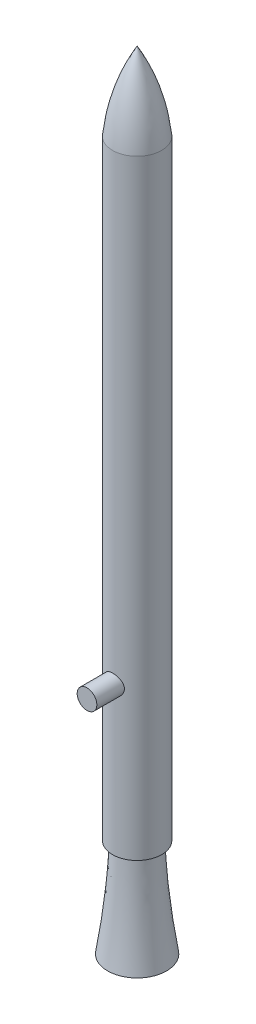
ISO-10303-21;
HEADER;
FILE_DESCRIPTION(('STEP AP214'),'2;1');
FILE_NAME('part.step','',(''),(''),'','','');
FILE_SCHEMA(('AUTOMOTIVE_DESIGN { 1 0 10303 214 1 1 1 1 }'));
ENDSEC;
DATA;
#1=APPLICATION_CONTEXT('core data for automotive mechanical design processes');
#2=APPLICATION_PROTOCOL_DEFINITION('international standard','automotive_design',2000,#1);
#3=PRODUCT_CONTEXT('',#1,'mechanical');
#4=PRODUCT('Part','Part','',(#3));
#5=PRODUCT_RELATED_PRODUCT_CATEGORY('part','',(#4));
#6=PRODUCT_DEFINITION_FORMATION('','',#4);
#7=PRODUCT_DEFINITION_CONTEXT('part definition',#1,'design');
#8=PRODUCT_DEFINITION('design','',#6,#7);
#9=PRODUCT_DEFINITION_SHAPE('','',#8);
#10=(LENGTH_UNIT() NAMED_UNIT(*) SI_UNIT(.MILLI.,.METRE.));
#11=(NAMED_UNIT(*) PLANE_ANGLE_UNIT() SI_UNIT($,.RADIAN.));
#12=(NAMED_UNIT(*) SI_UNIT($,.STERADIAN.) SOLID_ANGLE_UNIT());
#13=UNCERTAINTY_MEASURE_WITH_UNIT(LENGTH_MEASURE(1.E-05),#10,'distance_accuracy_value','');
#14=(GEOMETRIC_REPRESENTATION_CONTEXT(3) GLOBAL_UNCERTAINTY_ASSIGNED_CONTEXT((#13)) GLOBAL_UNIT_ASSIGNED_CONTEXT((#10,
#11,#12)) REPRESENTATION_CONTEXT('',''));
#15=CARTESIAN_POINT('',(0.,0.,0.));
#16=DIRECTION('',(0.,0.,1.));
#17=DIRECTION('',(1.,0.,0.));
#18=AXIS2_PLACEMENT_3D('',#15,#16,#17);
#19=CARTESIAN_POINT('',(0.,402.495416156833,0.));
#20=DIRECTION('',(0.,1.,0.));
#21=DIRECTION('',(0.,0.,1.));
#22=AXIS2_PLACEMENT_3D('',#19,#20,#21);
#23=CYLINDRICAL_SURFACE('',#22,250.000000000001);
#24=CARTESIAN_POINT('',(50.,2500.,-244.948974278318));
#25=CARTESIAN_POINT('',(49.999992344957,2501.38927586998,-244.948978091506));
#26=CARTESIAN_POINT('',(49.9420477303856,2502.77872480484,-244.960825763421));
#27=CARTESIAN_POINT('',(49.7107011907841,2505.54771697171,-245.007876943727));
#28=CARTESIAN_POINT('',(49.5372797458124,2506.92725848913,-245.043084400798));
#29=CARTESIAN_POINT('',(49.0761945639373,2509.66739984891,-245.135844853141));
#30=CARTESIAN_POINT('',(48.7884479608055,2511.02798520924,-245.193414056184));
#31=CARTESIAN_POINT('',(48.1009992505273,2513.7194392846,-245.329200120906));
#32=CARTESIAN_POINT('',(47.7013016421263,2515.05030919143,-245.407416152886));
#33=CARTESIAN_POINT('',(46.7934804348209,2517.67179590757,-245.582131761167));
#34=CARTESIAN_POINT('',(46.2854652861421,2518.96245150987,-245.678613039094));
#35=CARTESIAN_POINT('',(45.1645609164068,2521.49607920436,-245.887143200697));
#36=CARTESIAN_POINT('',(44.5516707419873,2522.73905086296,-245.999192225889));
#37=CARTESIAN_POINT('',(43.2255044861128,2525.16885567645,-246.235678044495));
#38=CARTESIAN_POINT('',(42.5122364537684,2526.35569332244,-246.360113844403));
#39=CARTESIAN_POINT('',(40.9902750338976,2528.66548964605,-246.617908561532));
#40=CARTESIAN_POINT('',(40.1815808640425,2529.78844779986,-246.751267551903));
#41=CARTESIAN_POINT('',(38.4634377890586,2531.97692557454,-247.024958237432));
#42=CARTESIAN_POINT('',(37.5528404143988,2533.04153533412,-247.165356946009));
#43=CARTESIAN_POINT('',(35.6456654320883,2535.09053304665,-247.447601580005));
#44=CARTESIAN_POINT('',(34.6490870984414,2536.07492032209,-247.589447517635));
#45=CARTESIAN_POINT('',(32.5766095135831,2537.95686822198,-247.870647459747));
#46=CARTESIAN_POINT('',(31.5007048438687,2538.8544229055,-248.010001293193));
#47=CARTESIAN_POINT('',(29.2768648788855,2540.55645178176,-248.282338984797));
#48=CARTESIAN_POINT('',(28.1289294035987,2541.36092574185,-248.415322827035));
#49=CARTESIAN_POINT('',(25.7584407357454,2542.87773217923,-248.672346947359));
#50=CARTESIAN_POINT('',(24.5353230499789,2543.58919784455,-248.796298895754));
#51=CARTESIAN_POINT('',(22.0321394761145,2544.90640336749,-249.030449515666));
#52=CARTESIAN_POINT('',(20.7520731534378,2545.51214241813,-249.140648082205));
#53=CARTESIAN_POINT('',(18.1441129561107,2546.6132433676,-249.344142767029));
#54=CARTESIAN_POINT('',(16.8162225507033,2547.10861325413,-249.43744010841));
#55=CARTESIAN_POINT('',(14.1220689879607,2547.98514109741,-249.604464060652));
#56=CARTESIAN_POINT('',(12.7558063915029,2548.36630072259,-249.678190957405));
#57=CARTESIAN_POINT('',(10.0130867761428,2549.00709324099,-249.803117838234));
#58=CARTESIAN_POINT('',(8.63700122335548,2549.26826108187,-249.85460181588));
#59=CARTESIAN_POINT('',(5.86712292042623,2549.67429994635,-249.93498429294));
#60=CARTESIAN_POINT('',(4.47333031050035,2549.81917189029,-249.963882971086));
#61=CARTESIAN_POINT('',(1.67833375249501,2549.99143390524,-249.998272626066));
#62=CARTESIAN_POINT('',(0.277130440352489,2550.01883389824,-250.003765579808));
#63=CARTESIAN_POINT('',(-2.5225208171731,2549.9559540338,-249.991192616829));
#64=CARTESIAN_POINT('',(-3.92096878394048,2549.8656750933,-249.973126883675));
#65=CARTESIAN_POINT('',(-6.68499625237991,2549.5703038186,-249.914374354252));
#66=CARTESIAN_POINT('',(-8.05076005989701,2549.36686754003,-249.874013898359));
#67=CARTESIAN_POINT('',(-10.7600101701659,2548.84797310716,-249.77201572997));
#68=CARTESIAN_POINT('',(-12.1034967198647,2548.5325161955,-249.710378253499));
#69=CARTESIAN_POINT('',(-14.7588737612817,2547.79200327982,-249.567513359007));
#70=CARTESIAN_POINT('',(-16.0707634266814,2547.36694441289,-249.486285429269));
#71=CARTESIAN_POINT('',(-18.6539305996116,2546.41042825654,-249.306452714331));
#72=CARTESIAN_POINT('',(-19.9252077134791,2545.87896993614,-249.207847760755));
#73=CARTESIAN_POINT('',(-22.4264306982884,2544.70987484557,-248.995262213484));
#74=CARTESIAN_POINT('',(-23.6560662808075,2544.07159120843,-248.881188803798));
#75=CARTESIAN_POINT('',(-26.0572978649221,2542.69580719278,-248.641254333519));
#76=CARTESIAN_POINT('',(-27.2288937241742,2541.95830657096,-248.515393244017));
#77=CARTESIAN_POINT('',(-29.5064151983384,2540.38915678702,-248.255282947057));
#78=CARTESIAN_POINT('',(-30.6123344536147,2539.55749852996,-248.121032929853));
#79=CARTESIAN_POINT('',(-32.75113487723,2537.80574050746,-247.847787415111));
#80=CARTESIAN_POINT('',(-33.7840151570575,2536.88563966644,-247.708791859875));
#81=CARTESIAN_POINT('',(-35.787295501769,2534.9463400678,-247.427384405649));
#82=CARTESIAN_POINT('',(-36.7562911086083,2533.92569245322,-247.284955211059));
#83=CARTESIAN_POINT('',(-38.6050247991491,2531.8061268176,-247.003090431034));
#84=CARTESIAN_POINT('',(-39.4847617951622,2530.70720784304,-246.863654882096));
#85=CARTESIAN_POINT('',(-41.1488678348685,2528.4385255,-246.591730915548));
#86=CARTESIAN_POINT('',(-41.9332345152392,2527.268760377,-246.459242670142));
#87=CARTESIAN_POINT('',(-43.4009733293186,2524.86638104931,-246.205017218443));
#88=CARTESIAN_POINT('',(-44.0843458593415,2523.63376709128,-246.083279969963));
#89=CARTESIAN_POINT('',(-45.3464414894094,2521.11144810839,-245.853844342931));
#90=CARTESIAN_POINT('',(-45.9249351657537,2519.82162542507,-245.746176882384));
#91=CARTESIAN_POINT('',(-46.9710398675145,2517.19644884438,-245.548376133083));
#92=CARTESIAN_POINT('',(-47.4386505139941,2515.86109479143,-245.45824290425));
#93=CARTESIAN_POINT('',(-48.2592621239872,2513.1545822946,-245.298223702858));
#94=CARTESIAN_POINT('',(-48.6122753214291,2511.78342768953,-245.228335569105));
#95=CARTESIAN_POINT('',(-49.2008974418805,2509.01520769786,-245.110917636318));
#96=CARTESIAN_POINT('',(-49.4365082552914,2507.61814272885,-245.063387477279));
#97=CARTESIAN_POINT('',(-49.7853709795761,2504.83253061114,-244.992750828118));
#98=CARTESIAN_POINT('',(-49.9006486311287,2503.44424711357,-244.969240133119));
#99=CARTESIAN_POINT('',(-50.014980286726,2500.6627101483,-244.945923030888));
#100=CARTESIAN_POINT('',(-50.0140356097805,2499.26945673718,-244.946116354639));
#101=CARTESIAN_POINT('',(-49.8959351937506,2496.48816963004,-244.970200718025));
#102=CARTESIAN_POINT('',(-49.7787856351993,2495.10013566037,-244.994090497328));
#103=CARTESIAN_POINT('',(-49.4292338278076,2492.33925630389,-245.064853788263));
#104=CARTESIAN_POINT('',(-49.1968318251813,2490.96641088464,-245.111727250794));
#105=CARTESIAN_POINT('',(-48.6214175860752,2488.2588385855,-245.22651324641));
#106=CARTESIAN_POINT('',(-48.279490227383,2486.92387212567,-245.294219179249));
#107=CARTESIAN_POINT('',(-47.4870410927173,2484.28773648272,-245.448861749017));
#108=CARTESIAN_POINT('',(-47.0365202230002,2482.98656701766,-245.535798225459));
#109=CARTESIAN_POINT('',(-46.0302138759689,2480.42678235451,-245.726436231992));
#110=CARTESIAN_POINT('',(-45.4744217864711,2479.16816983533,-245.830138815117));
#111=CARTESIAN_POINT('',(-44.2616102954817,2476.70197013557,-246.051396258329));
#112=CARTESIAN_POINT('',(-43.6045895376501,2475.49438363895,-246.168951304016));
#113=CARTESIAN_POINT('',(-42.1847296195536,2473.1228075798,-246.416262440492));
#114=CARTESIAN_POINT('',(-41.42062300066,2471.95959127499,-246.546157572327));
#115=CARTESIAN_POINT('',(-39.7985926672211,2469.70140799398,-246.813183077381));
#116=CARTESIAN_POINT('',(-38.9406682630056,2468.60644151959,-246.950313503785));
#117=CARTESIAN_POINT('',(-37.136768605078,2466.49191289575,-247.228018274879));
#118=CARTESIAN_POINT('',(-36.1907854135783,2465.47235755891,-247.368592929195));
#119=CARTESIAN_POINT('',(-34.2171663492078,2463.5155284846,-247.649306068989));
#120=CARTESIAN_POINT('',(-33.189529785351,2462.57825544358,-247.789444550766));
#121=CARTESIAN_POINT('',(-31.0430294198751,2460.7785531273,-248.067569719376));
#122=CARTESIAN_POINT('',(-29.9230059549897,2459.9174960821,-248.205490198393));
#123=CARTESIAN_POINT('',(-27.6134451842197,2458.29279313283,-248.473034393029));
#124=CARTESIAN_POINT('',(-26.42390707257,2457.52914835821,-248.602658012441));
#125=CARTESIAN_POINT('',(-23.9835436745959,2456.10483454493,-248.849941648259));
#126=CARTESIAN_POINT('',(-22.7327200703861,2455.44416268202,-248.967601992752));
#127=CARTESIAN_POINT('',(-20.1784915470321,2454.23071391631,-249.18762272896));
#128=CARTESIAN_POINT('',(-18.8750871610519,2453.6779359198,-249.289983275766));
#129=CARTESIAN_POINT('',(-16.2325615275738,2452.6873853024,-249.475946859591));
#130=CARTESIAN_POINT('',(-14.8936885669717,2452.24897006011,-249.559654305975));
#131=CARTESIAN_POINT('',(-12.1826711210453,2451.48644275413,-249.706678172043));
#132=CARTESIAN_POINT('',(-10.81052670553,2451.16233045063,-249.769994634507));
#133=CARTESIAN_POINT('',(-8.04308580416522,2450.63104403272,-249.874420220784));
#134=CARTESIAN_POINT('',(-6.64779166627997,2450.42385813275,-249.915531582732));
#135=CARTESIAN_POINT('',(-3.84420600321766,2450.12807509416,-249.974374281458));
#136=CARTESIAN_POINT('',(-2.43591465177961,2450.03947637262,-249.992105930307));
#137=CARTESIAN_POINT('',(0.358638400995768,2449.98209833555,-250.003579571549));
#138=CARTESIAN_POINT('',(1.74485654078014,2450.01125881142,-249.997734051015));
#139=CARTESIAN_POINT('',(4.50978769605547,2450.18453573875,-249.963143843918));
#140=CARTESIAN_POINT('',(5.88850080450128,2450.32865076314,-249.934399441625));
#141=CARTESIAN_POINT('',(8.62855178170661,2450.73068426934,-249.854811310789));
#142=CARTESIAN_POINT('',(9.9898899549193,2450.98860075422,-249.803967970024));
#143=CARTESIAN_POINT('',(12.6855963685322,2451.61621291712,-249.681589699063));
#144=CARTESIAN_POINT('',(14.0199645054308,2451.98590902402,-249.610054689476));
#145=CARTESIAN_POINT('',(16.6494066113678,2452.8332647284,-249.448448577958));
#146=CARTESIAN_POINT('',(17.9445636821703,2453.31067476844,-249.358420364587));
#147=CARTESIAN_POINT('',(20.4899443313465,2454.37037488139,-249.162179604726));
#148=CARTESIAN_POINT('',(21.7401680637626,2454.95266459471,-249.055967113725));
#149=CARTESIAN_POINT('',(24.1873935202015,2456.21795351528,-248.830223784338));
#150=CARTESIAN_POINT('',(25.384392115349,2456.90095863299,-248.710692164423));
#151=CARTESIAN_POINT('',(27.7172146222479,2458.36286631829,-248.461530874939));
#152=CARTESIAN_POINT('',(28.8530377356276,2459.14177013697,-248.331901073638));
#153=CARTESIAN_POINT('',(31.0738905467881,2460.80347511168,-248.063872068247));
#154=CARTESIAN_POINT('',(32.1578047442401,2461.68775009833,-247.925365104304));
#155=CARTESIAN_POINT('',(34.2475632107648,2463.54375983559,-247.645343379139));
#156=CARTESIAN_POINT('',(35.2534064728154,2464.515495714,-247.503828579148));
#157=CARTESIAN_POINT('',(37.1804808945906,2466.54009217778,-247.221683155537));
#158=CARTESIAN_POINT('',(38.1016920602941,2467.59297182558,-247.081052748123));
#159=CARTESIAN_POINT('',(39.8529509314188,2469.77258368871,-246.804636086908));
#160=CARTESIAN_POINT('',(40.6829992690011,2470.89931539183,-246.668849799519));
#161=CARTESIAN_POINT('',(42.2546031928156,2473.23160260142,-246.40452625796));
#162=CARTESIAN_POINT('',(42.9951084142612,2474.43787686939,-246.276082923509));
#163=CARTESIAN_POINT('',(44.3717202832077,2476.90991615761,-246.031785430628));
#164=CARTESIAN_POINT('',(45.0078213229278,2478.17568436871,-245.91593194854));
#165=CARTESIAN_POINT('',(46.1703012663192,2480.75668893815,-245.700330964962));
#166=CARTESIAN_POINT('',(46.6967700451887,2482.07188372462,-245.600570286029));
#167=CARTESIAN_POINT('',(47.6364843176399,2484.74322330291,-245.420037348009));
#168=CARTESIAN_POINT('',(48.0497517169173,2486.09936011553,-245.339261415598));
#169=CARTESIAN_POINT('',(48.6690140139464,2488.49175957459,-245.217044597207));
#170=CARTESIAN_POINT('',(48.9009879697861,2489.52114012774,-245.170827104832));
#171=CARTESIAN_POINT('',(49.2994837868582,2491.59322123542,-245.091008394178));
#172=CARTESIAN_POINT('',(49.4659941876441,2492.63592408928,-245.057409385013));
#173=CARTESIAN_POINT('',(49.7327072514396,2494.7300887016,-245.003421158296));
#174=CARTESIAN_POINT('',(49.8329116935999,2495.78155022428,-244.983031586303));
#175=CARTESIAN_POINT('',(49.9665548875057,2497.88864171517,-244.955807933714));
#176=CARTESIAN_POINT('',(50.0000058171685,2498.94427088786,-244.948971380627));
#177=CARTESIAN_POINT('',(50.,2500.,-244.948974278318));
#178=B_SPLINE_CURVE_WITH_KNOTS('',3,(#24,#25,#26,#27,#28,#29,#30,#31,#32,#33,#34,#35,#36,#37,
#38,#39,#40,#41,#42,#43,#44,#45,#46,#47,#48,#49,#50,#51,#52,#53,#54,#55,#56,#57,#58,#59,#60,#61,
#62,#63,#64,#65,#66,#67,#68,#69,#70,#71,#72,#73,#74,#75,#76,#77,#78,#79,#80,#81,#82,#83,#84,#85,
#86,#87,#88,#89,#90,#91,#92,#93,#94,#95,#96,#97,#98,#99,#100,#101,#102,#103,#104,#105,#106,#107,
#108,#109,#110,#111,#112,#113,#114,#115,#116,#117,#118,#119,#120,#121,#122,#123,#124,#125,#126,
#127,#128,#129,#130,#131,#132,#133,#134,#135,#136,#137,#138,#139,#140,#141,#142,#143,#144,#145,
#146,#147,#148,#149,#150,#151,#152,#153,#154,#155,#156,#157,#158,#159,#160,#161,#162,#163,#164,
#165,#166,#167,#168,#169,#170,#171,#172,#173,#174,#175,#176,#177),.UNSPECIFIED.,.T.,.F.,(4,2,2,
2,2,2,2,2,2,2,2,2,2,2,2,2,2,2,2,2,2,2,2,2,2,2,2,2,2,2,2,2,2,2,2,2,2,2,2,2,2,2,2,2,2,2,2,2,2,2,2,
2,2,2,2,2,2,2,2,2,2,2,2,2,2,2,2,2,2,2,2,2,2,2,2,2,4),(0.,4.16687263007994,8.33444979772641,
12.5050532746422,16.6754891801099,20.8417689857357,25.0080866668075,29.1740704489092,
33.3400883872187,37.5589793708714,41.7779059810006,45.9971210386217,50.2163466412443,
54.4724500071243,58.7285858571717,62.9844135790819,67.2401791268965,71.4398751585651,
75.63953795499,79.8388460299282,84.0381213845097,88.1774986663138,92.3168300317315,
96.4562695312197,100.595749142694,104.761267378561,108.926795829929,113.092726984714,
117.258708808893,121.497372794427,125.736088425303,129.9749090722,134.213713084972,
138.461680501079,142.709662434182,146.957190721846,151.204650614027,155.379393529153,
159.554089065034,163.728562575296,167.903027167656,172.037358808722,176.171655948321,
180.306212853149,184.440825160784,188.629320529907,192.817846691428,197.006750781014,
201.195690322694,205.449032571299,209.702424131451,213.955699013292,218.208930778173,
222.437721465038,226.666503279967,230.894858780678,235.123157840886,239.277805713339,
243.432402010078,247.586925407471,251.741464745463,255.886475703052,260.031472449174,
264.176712540417,268.322006716077,272.534197082486,276.74644177211,280.959679043722,
285.172887097146,289.431511725064,293.690365018377,297.945713090068,302.200237123049,
305.36680744973,308.533931888812,311.700971342773,314.867432977376),.UNSPECIFIED.);
#179=CARTESIAN_POINT('',(50.,2500.,-244.948974278318));
#180=VERTEX_POINT('',#179);
#181=EDGE_CURVE('E37',#180,#180,#178,.T.);
#182=ORIENTED_EDGE('',*,*,#181,.T.);
#183=EDGE_LOOP('',(#182));
#184=FACE_BOUND('',#183,.T.);
#185=CARTESIAN_POINT('',(0.,1000.,0.));
#186=DIRECTION('',(0.,1.,0.));
#187=DIRECTION('',(0.,0.,1.));
#188=AXIS2_PLACEMENT_3D('',#185,#186,#187);
#189=CIRCLE('',#188,250.000000000001);
#190=CARTESIAN_POINT('',(0.,1000.,250.000000000001));
#191=VERTEX_POINT('',#190);
#192=EDGE_CURVE('E56',#191,#191,#189,.T.);
#193=ORIENTED_EDGE('',*,*,#192,.T.);
#194=EDGE_LOOP('',(#193));
#195=FACE_BOUND('',#194,.T.);
#196=CARTESIAN_POINT('',(0.,7205.04507490799,0.));
#197=DIRECTION('',(0.,1.,0.));
#198=DIRECTION('',(0.,0.,1.));
#199=AXIS2_PLACEMENT_3D('',#196,#197,#198);
#200=CIRCLE('',#199,250.);
#201=CARTESIAN_POINT('',(0.,7205.04507490799,250.));
#202=VERTEX_POINT('',#201);
#203=EDGE_CURVE('E54',#202,#202,#200,.T.);
#204=ORIENTED_EDGE('',*,*,#203,.F.);
#205=EDGE_LOOP('',(#204));
#206=FACE_BOUND('',#205,.T.);
#207=CARTESIAN_POINT('',(0.,2400.,250.000000000001));
#208=CARTESIAN_POINT('',(1.34443918910818,2400.00000120163,249.999999044269));
#209=CARTESIAN_POINT('',(2.68895959985831,2400.02712100468,249.989147764124));
#210=CARTESIAN_POINT('',(5.37561012109808,2400.13553835224,249.945810720796));
#211=CARTESIAN_POINT('',(6.71773986807743,2400.21684353032,249.913321909339));
#212=CARTESIAN_POINT('',(9.39774710615844,2400.43348609089,249.826901687005));
#213=CARTESIAN_POINT('',(10.7356216171232,2400.56885536206,249.77295762123));
#214=CARTESIAN_POINT('',(13.4038313765272,2400.89327215723,249.643989236973));
#215=CARTESIAN_POINT('',(14.7341665532189,2401.08232019119,249.568964718223));
#216=CARTESIAN_POINT('',(17.3880683751208,2401.51412859001,249.398130422914));
#217=CARTESIAN_POINT('',(18.7116107929106,2401.75701805773,249.302270697925));
#218=CARTESIAN_POINT('',(21.3462928157659,2402.29563095615,249.090510508303));
#219=CARTESIAN_POINT('',(22.6574322899309,2402.59135494383,248.974609832406));
#220=CARTESIAN_POINT('',(25.2647028572698,2403.23483383793,248.72356071176));
#221=CARTESIAN_POINT('',(26.5608371974566,2403.58257725206,248.588416518669));
#222=CARTESIAN_POINT('',(29.1362939338311,2404.32934507584,248.299729429455));
#223=CARTESIAN_POINT('',(30.4156148164152,2404.72837406801,248.14618488929));
#224=CARTESIAN_POINT('',(32.9509467920324,2405.57534528805,247.822240404429));
#225=CARTESIAN_POINT('',(34.2070217289595,2406.02311878171,247.651898786049));
#226=CARTESIAN_POINT('',(36.6983719440695,2406.96772329253,247.294992453916));
#227=CARTESIAN_POINT('',(37.9336452407421,2407.46455895263,247.108426204966));
#228=CARTESIAN_POINT('',(40.3813237246668,2408.50618892702,246.720254246071));
#229=CARTESIAN_POINT('',(41.5937302690441,2409.05098038424,246.518649432194));
#230=CARTESIAN_POINT('',(43.9939816354032,2410.18745409074,246.10163392112));
#231=CARTESIAN_POINT('',(45.1818243416299,2410.77914035817,245.886222041177));
#232=CARTESIAN_POINT('',(48.7046376208913,2412.62220955533,245.221458033402));
#233=CARTESIAN_POINT('',(51.0005697641036,2413.94231729456,244.753308929984));
#234=CARTESIAN_POINT('',(55.4747062067772,2416.75613041791,243.778179929235));
#235=CARTESIAN_POINT('',(57.6529079216342,2418.24983961095,243.271199180002));
#236=CARTESIAN_POINT('',(60.8685715350783,2420.64694000845,242.4794985617));
#237=CARTESIAN_POINT('',(61.9532388272621,2421.49087302851,242.204481978087));
#238=CARTESIAN_POINT('',(64.0860316642256,2423.22196622078,241.648907277409));
#239=CARTESIAN_POINT('',(65.1341592126141,2424.10912401638,241.368349465515));
#240=CARTESIAN_POINT('',(67.1923700348856,2425.92524773061,240.803497138285));
#241=CARTESIAN_POINT('',(68.2024558145853,2426.85421088663,240.519202870741));
#242=CARTESIAN_POINT('',(70.1834584062609,2428.75278808654,239.948630335061));
#243=CARTESIAN_POINT('',(71.1543658856784,2429.72241170518,239.662351613022));
#244=CARTESIAN_POINT('',(74.0065740332669,2432.69058490755,238.803202146018));
#245=CARTESIAN_POINT('',(75.8270441050216,2434.74815765923,238.230105798686));
#246=CARTESIAN_POINT('',(79.2943232879578,2439.00857963684,237.09858193073));
#247=CARTESIAN_POINT('',(80.9411326101945,2441.21142868621,236.540154392278));
#248=CARTESIAN_POINT('',(83.3078981888259,2444.6659219674,235.712822262053));
#249=CARTESIAN_POINT('',(84.0949370293961,2445.86949077006,235.432998050436));
#250=CARTESIAN_POINT('',(85.6172277638508,2448.31094052206,234.88368368782));
#251=CARTESIAN_POINT('',(86.352491739858,2449.54881337166,234.614191132569));
#252=CARTESIAN_POINT('',(87.77001513689,2452.05732198711,234.087582492239));
#253=CARTESIAN_POINT('',(88.4522674790742,2453.32796209843,233.830468061795));
#254=CARTESIAN_POINT('',(89.7622789180197,2455.8999306633,233.330719808614));
#255=CARTESIAN_POINT('',(90.3900347200992,2457.20126096623,233.088086861655));
#256=CARTESIAN_POINT('',(91.5893563748734,2459.83187084517,232.619440688339));
#257=CARTESIAN_POINT('',(92.1609441561408,2461.16113926583,232.393420984755));
#258=CARTESIAN_POINT('',(93.2468387982724,2463.84583425884,231.959843265579));
#259=CARTESIAN_POINT('',(93.7611458602674,2465.20126073933,231.752285185162));
#260=CARTESIAN_POINT('',(94.7311440284947,2467.93577004373,231.357482205953));
#261=CARTESIAN_POINT('',(95.1868381137643,2469.3148516613,231.17023627486));
#262=CARTESIAN_POINT('',(96.0384061531344,2472.0941425864,230.817757026988));
#263=CARTESIAN_POINT('',(96.4342805273904,2473.49435174544,230.652523555601));
#264=CARTESIAN_POINT('',(97.1485154027833,2476.24925094289,230.352575596615));
#265=CARTESIAN_POINT('',(97.46957584626,2477.60312781753,230.216817324412));
#266=CARTESIAN_POINT('',(98.055267891023,2480.32508256622,229.967966736869));
#267=CARTESIAN_POINT('',(98.3199005389395,2481.69316017638,229.854874001128));
#268=CARTESIAN_POINT('',(98.7919870565493,2484.44087211935,229.652366169459));
#269=CARTESIAN_POINT('',(98.999441653375,2485.82050630496,229.562950772427));
#270=CARTESIAN_POINT('',(99.3565673775043,2488.58860310206,229.408610090931));
#271=CARTESIAN_POINT('',(99.5062384269943,2489.97706572543,229.343684839447));
#272=CARTESIAN_POINT('',(99.7472943514507,2492.75939826193,229.238946400878));
#273=CARTESIAN_POINT('',(99.8387037519255,2494.15326565096,229.19912264728));
#274=CARTESIAN_POINT('',(99.9630560443568,2496.9441065174,229.14491492964));
#275=CARTESIAN_POINT('',(99.9959987625562,2498.34108000403,229.130531041202));
#276=CARTESIAN_POINT('',(100.003315400308,2501.13515059438,229.127337779749));
#277=CARTESIAN_POINT('',(99.9776917098469,2502.53224769074,229.138527363128));
#278=CARTESIAN_POINT('',(99.867959259735,2505.32369200771,229.18637463168));
#279=CARTESIAN_POINT('',(99.783851344024,2506.71803926772,229.223031949349));
#280=CARTESIAN_POINT('',(99.5653141017869,2509.40398637259,229.318035271013));
#281=CARTESIAN_POINT('',(99.4348052497325,2510.69596724277,229.374689559083));
#282=CARTESIAN_POINT('',(99.1237343999705,2513.27289447792,229.509289603612));
#283=CARTESIAN_POINT('',(98.9431679426902,2514.55784020573,229.587237257063));
#284=CARTESIAN_POINT('',(98.5324819317179,2517.11813975886,229.763791594503));
#285=CARTESIAN_POINT('',(98.3023703348832,2518.39349509039,229.862394961155));
#286=CARTESIAN_POINT('',(97.7931197711435,2520.93281620498,230.079513066456));
#287=CARTESIAN_POINT('',(97.5139752542855,2522.1967806817,230.198030059029));
#288=CARTESIAN_POINT('',(96.907328749286,2524.71117759361,230.454069197611));
#289=CARTESIAN_POINT('',(96.5798239816045,2525.96160924657,230.59159243599));
#290=CARTESIAN_POINT('',(95.8772207377736,2528.44690054633,230.884610566822));
#291=CARTESIAN_POINT('',(95.5021219383028,2529.68176008729,231.040105581362));
#292=CARTESIAN_POINT('',(94.7051311770896,2532.13410245873,231.367940263988));
#293=CARTESIAN_POINT('',(94.2832361737345,2533.35158415388,231.54028102691));
#294=CARTESIAN_POINT('',(93.3935922921902,2535.76721254411,231.900554524923));
#295=CARTESIAN_POINT('',(92.9258470994566,2536.96536078421,232.08848600664));
#296=CARTESIAN_POINT('',(91.9353874628039,2539.36500436524,232.482632414874));
#297=CARTESIAN_POINT('',(91.4117455870202,2540.56606845637,232.689142325887));
#298=CARTESIAN_POINT('',(90.3187030823888,2542.9446735258,233.115585029283));
#299=CARTESIAN_POINT('',(89.7493047304962,2544.12221567095,233.335517153614));
#300=CARTESIAN_POINT('',(88.5658073083039,2546.4521781643,233.787294126954));
#301=CARTESIAN_POINT('',(87.9517117971339,2547.60460050325,234.019138027026));
#302=CARTESIAN_POINT('',(86.6797647147828,2549.88307775146,234.493238982694));
#303=CARTESIAN_POINT('',(86.0219042896816,2551.00912726266,234.735498141835));
#304=CARTESIAN_POINT('',(83.9841890362035,2554.34563016984,235.475572214673));
#305=CARTESIAN_POINT('',(82.5402080222738,2556.51442261353,235.98668071867));
#306=CARTESIAN_POINT('',(79.4903497731825,2560.72933346996,237.031393291959));
#307=CARTESIAN_POINT('',(77.8844641832367,2562.77544554331,237.564998521326));
#308=CARTESIAN_POINT('',(75.2959928621372,2565.82152689137,238.393413590168));
#309=CARTESIAN_POINT('',(74.3674753159376,2566.868803666,238.684868868265));
#310=CARTESIAN_POINT('',(72.4675972410793,2568.92317499045,239.268540437859));
#311=CARTESIAN_POINT('',(71.4962463532681,2569.93027848619,239.560756544318));
#312=CARTESIAN_POINT('',(69.5118535571023,2571.90312998917,240.1440649446));
#313=CARTESIAN_POINT('',(68.4988061482387,2572.86887250565,240.435157084577));
#314=CARTESIAN_POINT('',(66.4325203687863,2574.75747041578,241.014255755814));
#315=CARTESIAN_POINT('',(65.3792796255622,2575.68032327048,241.30226210363));
#316=CARTESIAN_POINT('',(63.2340222972818,2577.48174307969,241.873294572717));
#317=CARTESIAN_POINT('',(62.1420004508609,2578.36030398577,242.156320010388));
#318=CARTESIAN_POINT('',(59.9207770111167,2580.07163205707,242.715496409452));
#319=CARTESIAN_POINT('',(58.7915721677966,2580.90439520223,242.991646766202));
#320=CARTESIAN_POINT('',(56.4978016890819,2582.52253120743,243.535187309482));
#321=CARTESIAN_POINT('',(55.333239120541,2583.30790816009,243.802578251626));
#322=CARTESIAN_POINT('',(52.9702703302655,2584.8299812065,244.326861385698));
#323=CARTESIAN_POINT('',(51.7718611557412,2585.5666730341,244.583752656817));
#324=CARTESIAN_POINT('',(49.3190199020019,2587.00399233031,245.090255606699));
#325=CARTESIAN_POINT('',(48.0639481779686,2587.70361526336,245.339621996808));
#326=CARTESIAN_POINT('',(45.5226234751797,2589.04918840948,245.823847335158));
#327=CARTESIAN_POINT('',(44.2363706688903,2589.69513891934,246.058706363616));
#328=CARTESIAN_POINT('',(41.6347183711246,2590.93197993909,246.512259150096));
#329=CARTESIAN_POINT('',(40.3193163619825,2591.52286566983,246.730951504647));
#330=CARTESIAN_POINT('',(37.6619028072753,2592.64805889999,247.150541828426));
#331=CARTESIAN_POINT('',(36.3198940443968,2593.18237227939,247.35144164661));
#332=CARTESIAN_POINT('',(33.6119658675053,2594.19301289556,247.733939847785));
#333=CARTESIAN_POINT('',(32.2460536838117,2594.66935733154,247.915543953717));
#334=CARTESIAN_POINT('',(29.4926409483675,2595.56295744474,248.258149005862));
#335=CARTESIAN_POINT('',(28.1051426805363,2595.98021932664,248.41915211536));
#336=CARTESIAN_POINT('',(25.3111246656454,2596.75457873227,248.719362166973));
#337=CARTESIAN_POINT('',(23.9046049403059,2597.1116763247,248.858569133973));
#338=CARTESIAN_POINT('',(21.0753861035882,2597.76469578258,249.114121287595));
#339=CARTESIAN_POINT('',(19.6526872192227,2598.06061850527,249.230466794572));
#340=CARTESIAN_POINT('',(16.8787363815535,2598.57473562706,249.433209724484));
#341=CARTESIAN_POINT('',(15.5282438968041,2598.79649579468,249.520972837954));
#342=CARTESIAN_POINT('',(12.8180873427788,2599.18452729909,249.674865992117));
#343=CARTESIAN_POINT('',(11.4584233530543,2599.35079911653,249.740996220204));
#344=CARTESIAN_POINT('',(8.73257009025241,2599.62740015106,249.851161228027));
#345=CARTESIAN_POINT('',(7.36638103483926,2599.73773122124,249.895196739678));
#346=CARTESIAN_POINT('',(4.63008032279352,2599.90215686452,249.960867457703));
#347=CARTESIAN_POINT('',(3.25996865645307,2599.9562512983,249.982502608592));
#348=CARTESIAN_POINT('',(0.518818364152871,2600.00804743714,250.003217956326));
#349=CARTESIAN_POINT('',(-0.852219982956067,2600.0057618615,250.002303240415));
#350=CARTESIAN_POINT('',(-3.59284139916143,2599.94483561025,249.977937798479));
#351=CARTESIAN_POINT('',(-4.96242447016723,2599.88619500868,249.954487102059));
#352=CARTESIAN_POINT('',(-7.69743440676699,2599.71272275696,249.885215175801));
#353=CARTESIAN_POINT('',(-9.062861339912,2599.59789202505,249.839394311528));
#354=CARTESIAN_POINT('',(-11.7869277480958,2599.3123548075,249.725702842974));
#355=CARTESIAN_POINT('',(-13.1455672808516,2599.14164879784,249.657832426517));
#356=CARTESIAN_POINT('',(-15.7924220850825,2598.75376946784,249.504061650169));
#357=CARTESIAN_POINT('',(-17.0810512931324,2598.53903751047,249.419111892336));
#358=CARTESIAN_POINT('',(-19.6476623347927,2598.05954232989,249.230064979789));
#359=CARTESIAN_POINT('',(-20.9256432842345,2597.79477499442,249.125966251297));
#360=CARTESIAN_POINT('',(-23.4685399307727,2597.21588239819,248.899290635038));
#361=CARTESIAN_POINT('',(-24.7334573077038,2596.90176356987,248.776716155477));
#362=CARTESIAN_POINT('',(-27.2484503270448,2596.22483034891,248.513823950274));
#363=CARTESIAN_POINT('',(-28.4985245956823,2595.86201148659,248.373504596081));
#364=CARTESIAN_POINT('',(-30.9817104342371,2595.08850996016,248.07599096292));
#365=CARTESIAN_POINT('',(-32.2148223168833,2594.67782817982,247.918796995535));
#366=CARTESIAN_POINT('',(-34.6623235332931,2593.80943229937,247.588465678739));
#367=CARTESIAN_POINT('',(-35.8767112026095,2593.35171404547,247.415326921382));
#368=CARTESIAN_POINT('',(-38.2847791325609,2592.39023961949,247.054159853368));
#369=CARTESIAN_POINT('',(-39.4784606708649,2591.88648630012,246.866132465425));
#370=CARTESIAN_POINT('',(-41.8435840083754,2590.83386026593,246.476268965082));
#371=CARTESIAN_POINT('',(-43.0150237606602,2590.2849834229,246.274431589536));
#372=CARTESIAN_POINT('',(-45.3692844183429,2589.12576209247,245.851787323561));
#373=CARTESIAN_POINT('',(-46.5513647840479,2588.51405439878,245.630589851593));
#374=CARTESIAN_POINT('',(-48.8884369133824,2587.24499729435,245.176138150484));
#375=CARTESIAN_POINT('',(-50.0434261858896,2586.58764370816,244.942882818851));
#376=CARTESIAN_POINT('',(-53.465132805598,2584.54896027938,244.227160179166));
#377=CARTESIAN_POINT('',(-55.6891533649009,2583.10072953517,243.72863387778));
#378=CARTESIAN_POINT('',(-60.0109185799443,2580.03569605616,242.700696400696));
#379=CARTESIAN_POINT('',(-62.1086205768566,2578.41883687216,242.171274908972));
#380=CARTESIAN_POINT('',(-66.1666788723709,2575.0264222633,241.094125829789));
#381=CARTESIAN_POINT('',(-68.1270297414955,2573.25086057125,240.546397519925));
#382=CARTESIAN_POINT('',(-72.0249589641748,2569.42867783734,239.409264001398));
#383=CARTESIAN_POINT('',(-73.9524729462067,2567.37189835831,238.819496427513));
#384=CARTESIAN_POINT('',(-77.6286435373243,2563.10095370447,237.649983314523));
#385=CARTESIAN_POINT('',(-79.3772919729688,2560.88678134526,237.070238234411));
#386=CARTESIAN_POINT('',(-81.8572656829208,2557.45764093548,236.220559282696));
#387=CARTESIAN_POINT('',(-82.6602573954637,2556.29633639896,235.94059444572));
#388=CARTESIAN_POINT('',(-84.2172160932398,2553.9393603701,235.389341843153));
#389=CARTESIAN_POINT('',(-84.9711877769213,2552.74369218732,235.118053247235));
#390=CARTESIAN_POINT('',(-86.4288008119536,2550.31960832159,234.586155709618));
#391=CARTESIAN_POINT('',(-87.1324374268591,2549.09118957175,234.325547773935));
#392=CARTESIAN_POINT('',(-88.4878805569172,2546.60365831106,233.817062881498));
#393=CARTESIAN_POINT('',(-89.1396922642556,2545.34454889157,233.569184650276));
#394=CARTESIAN_POINT('',(-90.39639861085,2542.78485749849,233.085711518576));
#395=CARTESIAN_POINT('',(-91.0007646009118,2541.48398827284,232.850262599852));
#396=CARTESIAN_POINT('',(-92.1539005329255,2538.85509710744,232.396304974498));
#397=CARTESIAN_POINT('',(-92.7026763652132,2537.52707806244,232.177794473651));
#398=CARTESIAN_POINT('',(-93.7434530064174,2534.84585087078,231.759529787471));
#399=CARTESIAN_POINT('',(-94.2354461528344,2533.49263935308,231.559778134213));
#400=CARTESIAN_POINT('',(-95.1612587221813,2530.76378587054,231.180849196572));
#401=CARTESIAN_POINT('',(-95.5950847177091,2529.38814645968,231.00166958798));
#402=CARTESIAN_POINT('',(-96.4032506696668,2526.61756047284,230.665569024943));
#403=CARTESIAN_POINT('',(-96.7776200294752,2525.2226238134,230.508637072405));
#404=CARTESIAN_POINT('',(-97.4660248847964,2522.41566341914,230.21840403808));
#405=CARTESIAN_POINT('',(-97.7800669763471,2521.00364157032,230.085100372954));
#406=CARTESIAN_POINT('',(-98.3469252611908,2518.16526083791,229.843375498571));
#407=CARTESIAN_POINT('',(-98.599742131384,2516.738902113,229.734954014218));
#408=CARTESIAN_POINT('',(-99.0433645223014,2513.87485937237,229.544048763272));
#409=CARTESIAN_POINT('',(-99.2341711242674,2512.43717555456,229.461564544424));
#410=CARTESIAN_POINT('',(-99.541676768279,2509.65746621824,229.328324693245));
#411=CARTESIAN_POINT('',(-99.6627234387156,2508.31600870518,229.275711764323));
#412=CARTESIAN_POINT('',(-99.8505546572239,2505.62859108879,229.193973016939));
#413=CARTESIAN_POINT('',(-99.91733979731,2504.28263103474,229.164846942226));
#414=CARTESIAN_POINT('',(-99.9964553403544,2501.58886908521,229.130335788607));
#415=CARTESIAN_POINT('',(-100.008788197674,2500.24106727547,229.124949639658));
#416=CARTESIAN_POINT('',(-99.9789707031494,2497.54617656393,229.137962114972));
#417=CARTESIAN_POINT('',(-99.9368201641758,2496.19908766459,229.156360820927));
#418=CARTESIAN_POINT('',(-99.7981684989979,2493.5084731798,229.216777903111));
#419=CARTESIAN_POINT('',(-99.7016766282786,2492.16494702667,229.258792257089));
#420=CARTESIAN_POINT('',(-99.4546115272572,2489.4836800512,229.36607938434));
#421=CARTESIAN_POINT('',(-99.3040330306946,2488.14593980505,229.431354422435));
#422=CARTESIAN_POINT('',(-98.9492363150732,2485.47904941327,229.584594314391));
#423=CARTESIAN_POINT('',(-98.7450237763187,2484.14989837323,229.672556765442));
#424=CARTESIAN_POINT('',(-98.2834851519767,2481.50236997666,229.870440863182));
#425=CARTESIAN_POINT('',(-98.0261540637647,2480.18399364705,229.980364578117));
#426=CARTESIAN_POINT('',(-97.4703478406461,2477.6126820013,230.216460594323));
#427=CARTESIAN_POINT('',(-97.1739155189893,2476.35922899381,230.341813028514));
#428=CARTESIAN_POINT('',(-96.5333820433455,2473.86645161245,230.610985933702));
#429=CARTESIAN_POINT('',(-96.1892767115384,2472.62712848716,230.754808023205));
#430=CARTESIAN_POINT('',(-95.4542375736895,2470.16480012045,231.059833832783));
#431=CARTESIAN_POINT('',(-95.0633099289487,2468.94179275555,231.22103526565));
#432=CARTESIAN_POINT('',(-94.2353927687513,2466.51364002928,231.559691598563));
#433=CARTESIAN_POINT('',(-93.7983991495509,2465.3084962702,231.737147946478));
#434=CARTESIAN_POINT('',(-92.8792045698238,2462.91774620255,232.107084818784));
#435=CARTESIAN_POINT('',(-92.3969985702001,2461.73214208912,232.299567017462));
#436=CARTESIAN_POINT('',(-91.3883502027879,2459.38220917501,232.698223919629));
#437=CARTESIAN_POINT('',(-90.8619041457387,2458.21788215855,232.904399764754));
#438=CARTESIAN_POINT('',(-89.2176655306221,2454.75927551224,233.541411568393));
#439=CARTESIAN_POINT('',(-88.0347999251348,2452.49892198069,233.990801986983));
#440=CARTESIAN_POINT('',(-85.431459262102,2447.95471494678,234.954251091675));
#441=CARTESIAN_POINT('',(-84.0012578567014,2445.67692480362,235.470539146772));
#442=CARTESIAN_POINT('',(-80.9656056551783,2441.24817107079,236.531509517239));
#443=CARTESIAN_POINT('',(-79.3601495218339,2439.09721134669,237.076192697093));
#444=CARTESIAN_POINT('',(-75.9833180300531,2434.93292285168,238.179956227077));
#445=CARTESIAN_POINT('',(-74.2119010790129,2432.91962880199,238.73904016069));
#446=CARTESIAN_POINT('',(-70.5129251765996,2429.04151918468,239.857579828576));
#447=CARTESIAN_POINT('',(-68.5853615160129,2427.17670809851,240.417035573558));
#448=CARTESIAN_POINT('',(-65.5202001713665,2424.44112954023,241.264017129275));
#449=CARTESIAN_POINT('',(-64.4344705679071,2423.51313586121,241.556423414814));
#450=CARTESIAN_POINT('',(-62.2233540557785,2421.70380478894,242.135415943361));
#451=CARTESIAN_POINT('',(-61.0979705443049,2420.82246341504,242.422002681636));
#452=CARTESIAN_POINT('',(-58.8090265381495,2419.10782661215,242.98742455557));
#453=CARTESIAN_POINT('',(-57.6454600378276,2418.27453879867,243.266258458955));
#454=CARTESIAN_POINT('',(-55.2821746210912,2416.65774985117,243.814175689632));
#455=CARTESIAN_POINT('',(-54.0824594205684,2415.87424362544,244.083260012907));
#456=CARTESIAN_POINT('',(-51.6478255104965,2414.35795362836,244.610004570338));
#457=CARTESIAN_POINT('',(-50.4128844328023,2413.62520314649,244.867657267687));
#458=CARTESIAN_POINT('',(-47.9106317654584,2412.21255593305,245.369516111116));
#459=CARTESIAN_POINT('',(-46.6433235265271,2411.53265375974,245.613723640875));
#460=CARTESIAN_POINT('',(-44.078252360036,2410.22707113761,246.086993939155));
#461=CARTESIAN_POINT('',(-42.7804884635482,2409.60139241686,246.316056224951));
#462=CARTESIAN_POINT('',(-40.1568940533583,2408.40577645709,246.757356748492));
#463=CARTESIAN_POINT('',(-38.8310666421365,2407.83583309516,246.969596833785));
#464=CARTESIAN_POINT('',(-36.1783606896973,2406.76301661995,247.371971760807));
#465=CARTESIAN_POINT('',(-34.8519566425668,2406.25909659328,247.562443275138));
#466=CARTESIAN_POINT('',(-32.1767212886277,2405.30747660875,247.924343970322));
#467=CARTESIAN_POINT('',(-30.8278923148489,2404.85977084345,248.095775118006));
#468=CARTESIAN_POINT('',(-28.1098261099169,2404.02156092397,248.418419389037));
#469=CARTESIAN_POINT('',(-26.740584079458,2403.63107046301,248.569627671737));
#470=CARTESIAN_POINT('',(-23.9846237178436,2402.90845994715,248.850670762015));
#471=CARTESIAN_POINT('',(-22.597905582172,2402.57633923996,248.980505808442));
#472=CARTESIAN_POINT('',(-19.813653057786,2401.97223531099,249.217506742287));
#473=CARTESIAN_POINT('',(-18.4161604668079,2401.70008430528,249.32473583951));
#474=CARTESIAN_POINT('',(-15.6093041341215,2401.21549784619,249.516188462711));
#475=CARTESIAN_POINT('',(-14.1999405375607,2401.00306166376,249.600412269555));
#476=CARTESIAN_POINT('',(-11.373179306505,2400.63863742038,249.745175016677));
#477=CARTESIAN_POINT('',(-9.95578765499906,2400.48660915158,249.805729710813));
#478=CARTESIAN_POINT('',(-7.11515485460942,2400.24326533543,249.902768237734));
#479=CARTESIAN_POINT('',(-5.69191469495755,2400.15193991416,249.93925598524));
#480=CARTESIAN_POINT('',(-3.55654152057495,2400.06073230043,249.975712036737));
#481=CARTESIAN_POINT('',(-2.84546403264197,2400.03795983146,249.984818115361));
#482=CARTESIAN_POINT('',(-1.42293194513664,2400.00759336683,249.996962348466));
#483=CARTESIAN_POINT('',(-0.711477345740001,2399.9999993641,250.000000505774));
#484=CARTESIAN_POINT('',(0.,2400.,250.000000000001));
#485=B_SPLINE_CURVE_WITH_KNOTS('',3,(#207,#208,#209,#210,#211,#212,#213,#214,#215,#216,#217,
#218,#219,#220,#221,#222,#223,#224,#225,#226,#227,#228,#229,#230,#231,#232,#233,#234,#235,#236,
#237,#238,#239,#240,#241,#242,#243,#244,#245,#246,#247,#248,#249,#250,#251,#252,#253,#254,#255,
#256,#257,#258,#259,#260,#261,#262,#263,#264,#265,#266,#267,#268,#269,#270,#271,#272,#273,#274,
#275,#276,#277,#278,#279,#280,#281,#282,#283,#284,#285,#286,#287,#288,#289,#290,#291,#292,#293,
#294,#295,#296,#297,#298,#299,#300,#301,#302,#303,#304,#305,#306,#307,#308,#309,#310,#311,#312,
#313,#314,#315,#316,#317,#318,#319,#320,#321,#322,#323,#324,#325,#326,#327,#328,#329,#330,#331,
#332,#333,#334,#335,#336,#337,#338,#339,#340,#341,#342,#343,#344,#345,#346,#347,#348,#349,#350,
#351,#352,#353,#354,#355,#356,#357,#358,#359,#360,#361,#362,#363,#364,#365,#366,#367,#368,#369,
#370,#371,#372,#373,#374,#375,#376,#377,#378,#379,#380,#381,#382,#383,#384,#385,#386,#387,#388,
#389,#390,#391,#392,#393,#394,#395,#396,#397,#398,#399,#400,#401,#402,#403,#404,#405,#406,#407,
#408,#409,#410,#411,#412,#413,#414,#415,#416,#417,#418,#419,#420,#421,#422,#423,#424,#425,#426,
#427,#428,#429,#430,#431,#432,#433,#434,#435,#436,#437,#438,#439,#440,#441,#442,#443,#444,#445,
#446,#447,#448,#449,#450,#451,#452,#453,#454,#455,#456,#457,#458,#459,#460,#461,#462,#463,#464,
#465,#466,#467,#468,#469,#470,#471,#472,#473,#474,#475,#476,#477,#478,#479,#480,#481,#482,#483,
#484),.UNSPECIFIED.,.T.,.F.,(4,2,2,2,2,2,2,2,2,2,2,2,2,2,2,2,2,2,2,2,2,2,2,2,2,2,2,2,2,2,2,2,2,
2,2,2,2,2,2,2,2,2,2,2,2,2,2,2,2,2,2,2,2,2,2,2,2,2,2,2,2,2,2,2,2,2,2,2,2,2,2,2,2,2,2,2,2,2,2,2,2,
2,2,2,2,2,2,2,2,2,2,2,2,2,2,2,2,2,2,2,2,2,2,2,2,2,2,2,2,2,2,2,2,2,2,2,2,2,2,2,2,2,2,2,2,2,2,2,2,
2,2,2,2,2,2,2,2,2,4),(0.,4.03314138084723,8.06685106694637,12.1029434824444,16.1390742429211,
20.1849897290196,24.2309478681327,28.2760134773221,32.3214407762594,36.3532847801846,
40.3855106990082,44.4174965502718,48.44982825379,56.5089821252361,64.5683128521505,
68.7719999491345,72.9754561787535,77.1786350401209,81.3828092891913,89.7924467079993,
98.2020739062042,102.596013796325,106.988924900158,111.382421601219,115.776183733943,
120.168223624244,124.560248092209,128.952049244786,133.343819549246,137.536544175301,
141.729191027383,145.921784559183,150.114383736868,154.305216853031,158.496062423914,
162.68673697719,166.877351059372,170.775577577877,174.674151496428,178.572099777636,
182.470489545628,186.369103463637,190.26774386758,194.166637820081,198.065218634589,
202.043408302148,206.021400127612,209.999075540743,213.977558124499,221.934575508582,
229.892003710101,234.179897540022,238.466831136442,242.754332079253,247.042086508362,
251.330424888743,255.619139093465,259.90748236106,264.196200907922,268.569944429155,
272.94366376422,277.317762348661,281.691405853186,286.063748530753,290.435631696272,
294.807509870047,299.179326776752,303.292193396133,307.405024387217,311.51771912687,
315.630424053612,319.74220116371,323.853972872314,327.965677390247,332.077346884424,
336.003681810708,339.930339571146,343.856485956367,347.782992928869,351.709427412637,
355.636208938852,359.562747295398,363.48964527843,367.536178452377,371.583082272193,
379.67498283924,387.769600957539,395.864538875017,404.494377694768,413.124610687683,
417.441698601148,421.758372120555,426.075451298823,430.392097415139,434.751498975003,
439.110438128217,443.469964809342,447.828998469807,452.185869678212,456.542264245356,
460.898610646425,465.254881083999,469.297404239896,473.339883289707,477.382180128536,
481.424490851177,485.46611329043,489.508129357663,493.5497175133,497.591686473394,
501.472938733791,505.354531342791,509.235613736944,513.117042166311,516.998903711473,
520.881089294133,528.644008025115,536.851363174404,545.05896834093,553.268636003562,
561.478551353024,565.851174168535,570.223423282912,574.596363417359,578.968855560442,
583.344188880396,587.719071077801,592.094092648581,596.468633051913,600.76213245656,
605.055187938019,609.34926919443,613.643302460738,617.92516483405,622.206974928505,
626.4859302324,630.764189351339,632.898529144241,635.03286794356),.UNSPECIFIED.);
#486=CARTESIAN_POINT('',(0.,2400.,250.000000000001));
#487=VERTEX_POINT('',#486);
#488=EDGE_CURVE('E11',#487,#487,#485,.T.);
#489=ORIENTED_EDGE('',*,*,#488,.F.);
#490=EDGE_LOOP('',(#489));
#491=FACE_BOUND('',#490,.T.);
#492=ADVANCED_FACE('F32',(#184,#195,#206,#491),#23,.T.);
#493=CARTESIAN_POINT('',(250.,7205.04507490799,0.));
#494=CARTESIAN_POINT('',(210.009020848593,7628.44948937109,0.));
#495=CARTESIAN_POINT('',(0.,8000.,0.));
#496=B_SPLINE_CURVE_WITH_KNOTS('',2,(#493,#494,#495),.UNSPECIFIED.,.F.,.F.,(3,3),(0.,1.),.UNSPECIFIED.);
#497=CARTESIAN_POINT('',(0.,402.495416156833,0.));
#498=DIRECTION('',(0.,1.,0.));
#499=AXIS1_PLACEMENT('',#497,#498);
#500=SURFACE_OF_REVOLUTION('',#496,#499);
#501=CARTESIAN_POINT('',(0.,8000.,0.));
#502=VERTEX_POINT('',#501);
#503=VERTEX_LOOP('',#502);
#504=FACE_BOUND('',#503,.T.);
#505=ORIENTED_EDGE('',*,*,#203,.T.);
#506=EDGE_LOOP('',(#505));
#507=FACE_BOUND('',#506,.T.);
#508=ADVANCED_FACE('F34',(#504,#507),#500,.T.);
#509=CARTESIAN_POINT('',(50.0000000000009,1000.,0.));
#510=DIRECTION('',(0.,1.,0.));
#511=DIRECTION('',(0.,0.,1.));
#512=AXIS2_PLACEMENT_3D('',#509,#510,#511);
#513=PLANE('',#512);
#514=CARTESIAN_POINT('',(0.,1000.,0.));
#515=DIRECTION('',(0.,1.,0.));
#516=DIRECTION('',(0.,0.,1.));
#517=AXIS2_PLACEMENT_3D('',#514,#515,#516);
#518=CIRCLE('',#517,50.0000000000009);
#519=CARTESIAN_POINT('',(0.,1000.,50.0000000000009));
#520=VERTEX_POINT('',#519);
#521=EDGE_CURVE('E46',#520,#520,#518,.T.);
#522=ORIENTED_EDGE('',*,*,#521,.F.);
#523=EDGE_LOOP('',(#522));
#524=FACE_BOUND('',#523,.T.);
#525=ADVANCED_FACE('F51',(#524),#513,.F.);
#526=CARTESIAN_POINT('',(50.0000000000009,1000.,0.));
#527=CARTESIAN_POINT('',(88.9264202292416,498.892463953587,0.));
#528=CARTESIAN_POINT('',(150.,0.,0.));
#529=B_SPLINE_CURVE_WITH_KNOTS('',2,(#526,#527,#528),.UNSPECIFIED.,.F.,.F.,(3,3),(0.,1.),.UNSPECIFIED.);
#530=CARTESIAN_POINT('',(0.,402.495416156833,0.));
#531=DIRECTION('',(0.,1.,0.));
#532=AXIS1_PLACEMENT('',#530,#531);
#533=SURFACE_OF_REVOLUTION('',#529,#532);
#534=CARTESIAN_POINT('',(0.,0.,0.));
#535=DIRECTION('',(0.,1.,0.));
#536=DIRECTION('',(0.,0.,1.));
#537=AXIS2_PLACEMENT_3D('',#534,#535,#536);
#538=CIRCLE('',#537,150.);
#539=CARTESIAN_POINT('',(0.,0.,150.));
#540=VERTEX_POINT('',#539);
#541=EDGE_CURVE('E75',#540,#540,#538,.T.);
#542=ORIENTED_EDGE('',*,*,#541,.F.);
#543=EDGE_LOOP('',(#542));
#544=FACE_BOUND('',#543,.T.);
#545=ORIENTED_EDGE('',*,*,#521,.T.);
#546=EDGE_LOOP('',(#545));
#547=FACE_BOUND('',#546,.T.);
#548=ADVANCED_FACE('F130',(#544,#547),#533,.T.);
#549=CARTESIAN_POINT('',(300.,0.,0.));
#550=DIRECTION('',(0.,1.,0.));
#551=DIRECTION('',(0.,0.,1.));
#552=AXIS2_PLACEMENT_3D('',#549,#550,#551);
#553=PLANE('',#552);
#554=CARTESIAN_POINT('',(0.,0.,0.));
#555=DIRECTION('',(0.,1.,0.));
#556=DIRECTION('',(0.,0.,1.));
#557=AXIS2_PLACEMENT_3D('',#554,#555,#556);
#558=CIRCLE('',#557,300.);
#559=CARTESIAN_POINT('',(0.,0.,300.));
#560=VERTEX_POINT('',#559);
#561=EDGE_CURVE('E72',#560,#560,#558,.T.);
#562=ORIENTED_EDGE('',*,*,#561,.F.);
#563=EDGE_LOOP('',(#562));
#564=FACE_BOUND('',#563,.T.);
#565=ORIENTED_EDGE('',*,*,#541,.T.);
#566=EDGE_LOOP('',(#565));
#567=FACE_BOUND('',#566,.T.);
#568=ADVANCED_FACE('F124',(#564,#567),#553,.F.);
#569=CARTESIAN_POINT('',(300.,0.,0.));
#570=CARTESIAN_POINT('',(219.109622660392,496.911485783753,0.));
#571=CARTESIAN_POINT('',(200.000000000001,1000.,0.));
#572=B_SPLINE_CURVE_WITH_KNOTS('',2,(#569,#570,#571),.UNSPECIFIED.,.F.,.F.,(3,3),(0.,1.),.UNSPECIFIED.);
#573=CARTESIAN_POINT('',(0.,402.495416156833,0.));
#574=DIRECTION('',(0.,1.,0.));
#575=AXIS1_PLACEMENT('',#573,#574);
#576=SURFACE_OF_REVOLUTION('',#572,#575);
#577=CARTESIAN_POINT('',(0.,1000.,0.));
#578=DIRECTION('',(0.,1.,0.));
#579=DIRECTION('',(0.,0.,1.));
#580=AXIS2_PLACEMENT_3D('',#577,#578,#579);
#581=CIRCLE('',#580,200.000000000001);
#582=CARTESIAN_POINT('',(0.,1000.,200.000000000001));
#583=VERTEX_POINT('',#582);
#584=EDGE_CURVE('E60',#583,#583,#581,.T.);
#585=ORIENTED_EDGE('',*,*,#584,.F.);
#586=EDGE_LOOP('',(#585));
#587=FACE_BOUND('',#586,.T.);
#588=ORIENTED_EDGE('',*,*,#561,.T.);
#589=EDGE_LOOP('',(#588));
#590=FACE_BOUND('',#589,.T.);
#591=ADVANCED_FACE('F119',(#587,#590),#576,.T.);
#592=CARTESIAN_POINT('',(250.000000000001,1000.,0.));
#593=DIRECTION('',(0.,1.,0.));
#594=DIRECTION('',(0.,0.,1.));
#595=AXIS2_PLACEMENT_3D('',#592,#593,#594);
#596=PLANE('',#595);
#597=ORIENTED_EDGE('',*,*,#192,.F.);
#598=EDGE_LOOP('',(#597));
#599=FACE_BOUND('',#598,.T.);
#600=ORIENTED_EDGE('',*,*,#584,.T.);
#601=EDGE_LOOP('',(#600));
#602=FACE_BOUND('',#601,.T.);
#603=ADVANCED_FACE('F90',(#599,#602),#596,.F.);
#604=CARTESIAN_POINT('',(0.,2500.,510.));
#605=DIRECTION('',(0.,0.,-1.));
#606=DIRECTION('',(-1.,0.,0.));
#607=AXIS2_PLACEMENT_3D('',#604,#605,#606);
#608=CYLINDRICAL_SURFACE('',#607,100.);
#609=CARTESIAN_POINT('',(0.,2500.,510.));
#610=DIRECTION('',(0.,0.,1.));
#611=DIRECTION('',(1.,0.,0.));
#612=AXIS2_PLACEMENT_3D('',#609,#610,#611);
#613=CIRCLE('',#612,100.);
#614=CARTESIAN_POINT('',(100.,2500.,510.));
#615=VERTEX_POINT('',#614);
#616=EDGE_CURVE('E57',#615,#615,#613,.T.);
#617=ORIENTED_EDGE('',*,*,#616,.F.);
#618=EDGE_LOOP('',(#617));
#619=FACE_BOUND('',#618,.T.);
#620=ORIENTED_EDGE('',*,*,#488,.T.);
#621=EDGE_LOOP('',(#620));
#622=FACE_BOUND('',#621,.T.);
#623=ADVANCED_FACE('F85',(#619,#622),#608,.T.);
#624=CARTESIAN_POINT('',(0.,2500.,510.));
#625=DIRECTION('',(0.,0.,1.));
#626=DIRECTION('',(1.,0.,0.));
#627=AXIS2_PLACEMENT_3D('',#624,#625,#626);
#628=PLANE('',#627);
#629=ORIENTED_EDGE('',*,*,#616,.T.);
#630=EDGE_LOOP('',(#629));
#631=FACE_BOUND('',#630,.T.);
#632=ADVANCED_FACE('F89',(#631),#628,.T.);
#633=CARTESIAN_POINT('',(0.,2500.,-510.));
#634=DIRECTION('',(0.,0.,1.));
#635=DIRECTION('',(1.,0.,0.));
#636=AXIS2_PLACEMENT_3D('',#633,#634,#635);
#637=CYLINDRICAL_SURFACE('',#636,50.);
#638=CARTESIAN_POINT('',(0.,2500.,0.));
#639=DIRECTION('',(0.,0.,1.));
#640=DIRECTION('',(1.,0.,0.));
#641=AXIS2_PLACEMENT_3D('',#638,#639,#640);
#642=CIRCLE('',#641,50.);
#643=CARTESIAN_POINT('',(50.,2500.,0.));
#644=VERTEX_POINT('',#643);
#645=EDGE_CURVE('E155',#644,#644,#642,.T.);
#646=ORIENTED_EDGE('',*,*,#645,.T.);
#647=EDGE_LOOP('',(#646));
#648=FACE_BOUND('',#647,.T.);
#649=ORIENTED_EDGE('',*,*,#181,.F.);
#650=EDGE_LOOP('',(#649));
#651=FACE_BOUND('',#650,.T.);
#652=ADVANCED_FACE('F93',(#648,#651),#637,.F.);
#653=CARTESIAN_POINT('',(0.,2500.,0.));
#654=DIRECTION('',(0.,0.,1.));
#655=DIRECTION('',(1.,0.,0.));
#656=AXIS2_PLACEMENT_3D('',#653,#654,#655);
#657=PLANE('',#656);
#658=ORIENTED_EDGE('',*,*,#645,.F.);
#659=EDGE_LOOP('',(#658));
#660=FACE_BOUND('',#659,.T.);
#661=ADVANCED_FACE('F98',(#660),#657,.F.);
#662=CLOSED_SHELL('',(#492,#508,#525,#548,#568,#591,#603,#623,#632,#652,#661));
#663=MANIFOLD_SOLID_BREP('B2',#662);
#664=ADVANCED_BREP_SHAPE_REPRESENTATION('',(#18,#663),#14);
#665=SHAPE_DEFINITION_REPRESENTATION(#9,#664);
ENDSEC;
END-ISO-10303-21;
